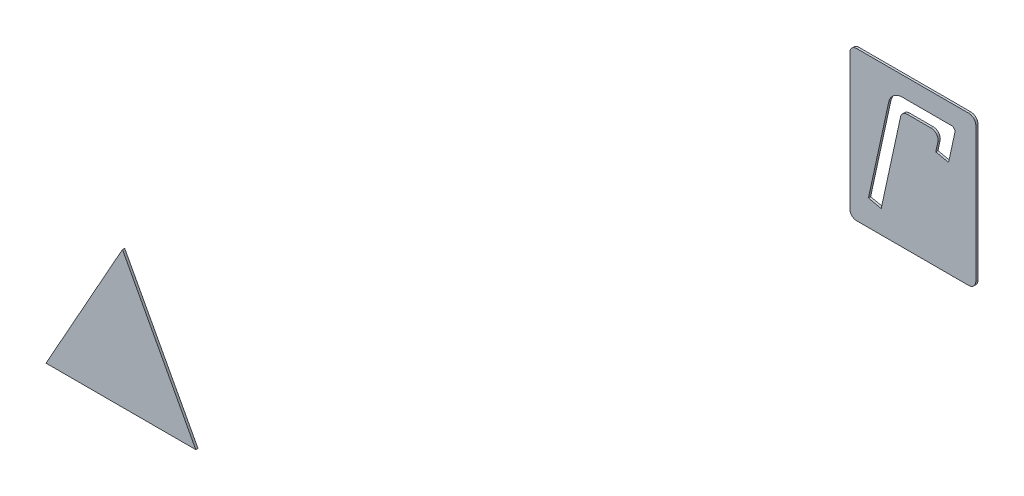
ISO-10303-21;
HEADER;
FILE_DESCRIPTION(('STEP AP214'),'2;1');
FILE_NAME('part.step','',(''),(''),'','','');
FILE_SCHEMA(('AUTOMOTIVE_DESIGN { 1 0 10303 214 1 1 1 1 }'));
ENDSEC;
DATA;
#1=APPLICATION_CONTEXT('core data for automotive mechanical design processes');
#2=APPLICATION_PROTOCOL_DEFINITION('international standard','automotive_design',2000,#1);
#3=PRODUCT_CONTEXT('',#1,'mechanical');
#4=PRODUCT('Part','Part','',(#3));
#5=PRODUCT_RELATED_PRODUCT_CATEGORY('part','',(#4));
#6=PRODUCT_DEFINITION_FORMATION('','',#4);
#7=PRODUCT_DEFINITION_CONTEXT('part definition',#1,'design');
#8=PRODUCT_DEFINITION('design','',#6,#7);
#9=PRODUCT_DEFINITION_SHAPE('','',#8);
#10=(LENGTH_UNIT() NAMED_UNIT(*) SI_UNIT(.MILLI.,.METRE.));
#11=(NAMED_UNIT(*) PLANE_ANGLE_UNIT() SI_UNIT($,.RADIAN.));
#12=(NAMED_UNIT(*) SI_UNIT($,.STERADIAN.) SOLID_ANGLE_UNIT());
#13=UNCERTAINTY_MEASURE_WITH_UNIT(LENGTH_MEASURE(1.E-05),#10,'distance_accuracy_value','');
#14=(GEOMETRIC_REPRESENTATION_CONTEXT(3) GLOBAL_UNCERTAINTY_ASSIGNED_CONTEXT((#13)) GLOBAL_UNIT_ASSIGNED_CONTEXT((#10,
#11,#12)) REPRESENTATION_CONTEXT('',''));
#15=CARTESIAN_POINT('',(0.,0.,0.));
#16=DIRECTION('',(0.,0.,1.));
#17=DIRECTION('',(1.,0.,0.));
#18=AXIS2_PLACEMENT_3D('',#15,#16,#17);
#19=CARTESIAN_POINT('',(9.86501290286,-17.72608045677,4.341));
#20=DIRECTION('',(0.,0.,1.));
#21=DIRECTION('',(1.,0.,0.));
#22=AXIS2_PLACEMENT_3D('',#19,#20,#21);
#23=PLANE('',#22);
#24=DIRECTION('',(1.,0.,0.));
#25=VECTOR('',#24,1.);
#26=CARTESIAN_POINT('',(9.761467361042,-17.97264852336,4.341));
#27=LINE('',#26,#25);
#28=CARTESIAN_POINT('',(9.41625321547516,-17.9726485233601,4.341));
#29=VERTEX_POINT('',#28);
#30=CARTESIAN_POINT('',(10.09247398621,-17.97264852336,4.341));
#31=VERTEX_POINT('',#30);
#32=EDGE_CURVE('P0_E20',#29,#31,#27,.T.);
#33=ORIENTED_EDGE('',*,*,#32,.F.);
#34=DIRECTION('',(-0.488242865136101,-0.872707800265181,0.));
#35=VECTOR('',#34,1.);
#36=CARTESIAN_POINT('',(9.761467361042,-17.35559684865,4.341));
#37=LINE('',#36,#35);
#38=CARTESIAN_POINT('',(9.76146736104225,-17.3555968486499,4.341));
#39=VERTEX_POINT('',#38);
#40=EDGE_CURVE('P0_E52',#39,#29,#37,.T.);
#41=ORIENTED_EDGE('',*,*,#40,.F.);
#42=DIRECTION('',(-0.472713166838797,0.881216353625621,0.));
#43=VECTOR('',#42,1.);
#44=CARTESIAN_POINT('',(10.09247398621,-17.97264852336,4.341));
#45=LINE('',#44,#43);
#46=EDGE_CURVE('P0_E53',#31,#39,#45,.T.);
#47=ORIENTED_EDGE('',*,*,#46,.F.);
#48=EDGE_LOOP('',(#33,#41,#47));
#49=FACE_BOUND('',#48,.T.);
#50=ADVANCED_FACE('P0_F17',(#49),#23,.F.);
#51=CARTESIAN_POINT('',(9.761467361042,-17.97264852336,4.341));
#52=DIRECTION('',(0.,-1.,0.));
#53=DIRECTION('',(1.,0.,0.));
#54=AXIS2_PLACEMENT_3D('',#51,#52,#53);
#55=PLANE('',#54);
#56=DIRECTION('',(1.,0.,0.));
#57=VECTOR('',#56,1.);
#58=CARTESIAN_POINT('',(9.86501290286,-17.97264852336,4.351));
#59=LINE('',#58,#57);
#60=CARTESIAN_POINT('',(9.41625321547516,-17.9726485233601,4.351));
#61=VERTEX_POINT('',#60);
#62=CARTESIAN_POINT('',(10.09247398621,-17.97264852336,4.351));
#63=VERTEX_POINT('',#62);
#64=EDGE_CURVE('P0_E60',#61,#63,#59,.T.);
#65=ORIENTED_EDGE('',*,*,#64,.F.);
#66=DIRECTION('',(0.,0.,1.));
#67=VECTOR('',#66,1.);
#68=CARTESIAN_POINT('',(9.41625321547566,-17.9726485233604,4.341));
#69=LINE('',#68,#67);
#70=EDGE_CURVE('P0_E57',#29,#61,#69,.T.);
#71=ORIENTED_EDGE('',*,*,#70,.F.);
#72=ORIENTED_EDGE('',*,*,#32,.T.);
#73=DIRECTION('',(0.,0.,1.));
#74=VECTOR('',#73,1.);
#75=CARTESIAN_POINT('',(10.09247398621,-17.97264852336,4.341));
#76=LINE('',#75,#74);
#77=EDGE_CURVE('P0_E64',#63,#31,#76,.F.);
#78=ORIENTED_EDGE('',*,*,#77,.F.);
#79=EDGE_LOOP('',(#65,#71,#72,#78));
#80=FACE_BOUND('',#79,.T.);
#81=ADVANCED_FACE('P0_F58',(#80),#55,.T.);
#82=CARTESIAN_POINT('',(10.09247398621,-17.97264852336,4.341));
#83=DIRECTION('',(0.881216353625621,0.472713166838797,0.));
#84=DIRECTION('',(-0.472713166838797,0.881216353625621,0.));
#85=AXIS2_PLACEMENT_3D('',#82,#83,#84);
#86=PLANE('',#85);
#87=DIRECTION('',(-0.472713166840206,0.881216353624866,0.));
#88=VECTOR('',#87,1.);
#89=CARTESIAN_POINT('',(10.09247398621,-17.97264852336,4.351));
#90=LINE('',#89,#88);
#91=CARTESIAN_POINT('',(9.76146736104249,-17.3555968486497,4.351));
#92=VERTEX_POINT('',#91);
#93=EDGE_CURVE('P0_E26',#63,#92,#90,.T.);
#94=ORIENTED_EDGE('',*,*,#93,.F.);
#95=ORIENTED_EDGE('',*,*,#77,.T.);
#96=ORIENTED_EDGE('',*,*,#46,.T.);
#97=DIRECTION('',(0.,0.,1.));
#98=VECTOR('',#97,1.);
#99=CARTESIAN_POINT('',(9.761467361042,-17.35559684865,4.341));
#100=LINE('',#99,#98);
#101=EDGE_CURVE('P0_E35',#92,#39,#100,.F.);
#102=ORIENTED_EDGE('',*,*,#101,.F.);
#103=EDGE_LOOP('',(#94,#95,#96,#102));
#104=FACE_BOUND('',#103,.T.);
#105=ADVANCED_FACE('P0_F68',(#104),#86,.T.);
#106=CARTESIAN_POINT('',(9.761467361042,-17.35559684865,4.341));
#107=DIRECTION('',(-0.872707800265181,0.488242865136101,0.));
#108=DIRECTION('',(-0.488242865136101,-0.872707800265181,0.));
#109=AXIS2_PLACEMENT_3D('',#106,#107,#108);
#110=PLANE('',#109);
#111=DIRECTION('',(-0.488242865137037,-0.872707800264657,0.));
#112=VECTOR('',#111,1.);
#113=CARTESIAN_POINT('',(9.761467361042,-17.35559684865,4.351));
#114=LINE('',#113,#112);
#115=EDGE_CURVE('P0_E11',#92,#61,#114,.T.);
#116=ORIENTED_EDGE('',*,*,#115,.F.);
#117=ORIENTED_EDGE('',*,*,#101,.T.);
#118=ORIENTED_EDGE('',*,*,#40,.T.);
#119=ORIENTED_EDGE('',*,*,#70,.T.);
#120=EDGE_LOOP('',(#116,#117,#118,#119));
#121=FACE_BOUND('',#120,.T.);
#122=ADVANCED_FACE('P0_F63',(#121),#110,.T.);
#123=CARTESIAN_POINT('',(9.86501290286,-17.72608045677,4.351));
#124=DIRECTION('',(0.,0.,1.));
#125=DIRECTION('',(1.,0.,0.));
#126=AXIS2_PLACEMENT_3D('',#123,#124,#125);
#127=PLANE('',#126);
#128=ORIENTED_EDGE('',*,*,#93,.T.);
#129=ORIENTED_EDGE('',*,*,#115,.T.);
#130=ORIENTED_EDGE('',*,*,#64,.T.);
#131=EDGE_LOOP('',(#128,#129,#130));
#132=FACE_BOUND('',#131,.T.);
#133=ADVANCED_FACE('P0_F72',(#132),#127,.T.);
#134=CLOSED_SHELL('',(#50,#81,#105,#122,#133));
#135=MANIFOLD_SOLID_BREP('P0_B1',#134);
#136=CARTESIAN_POINT('',(13.329788025237,-15.24896694961,4.341));
#137=DIRECTION('',(0.,0.,1.));
#138=DIRECTION('',(1.,0.,0.));
#139=AXIS2_PLACEMENT_3D('',#136,#137,#138);
#140=PLANE('',#139);
#141=DIRECTION('',(0.212429649393078,0.977176362822359,0.));
#142=VECTOR('',#141,1.);
#143=CARTESIAN_POINT('',(13.491343037065,-15.15019530967,4.341));
#144=LINE('',#143,#142);
#145=CARTESIAN_POINT('',(13.4913430370655,-15.1501953096677,4.341));
#146=VERTEX_POINT('',#145);
#147=CARTESIAN_POINT('',(13.5213893741724,-15.0119821624201,4.341));
#148=VERTEX_POINT('',#147);
#149=EDGE_CURVE('P1_E220',#146,#148,#144,.T.);
#150=ORIENTED_EDGE('',*,*,#149,.T.);
#151=DIRECTION('',(-0.598473967642059,0.801142253320078,0.));
#152=VECTOR('',#151,1.);
#153=CARTESIAN_POINT('',(13.521389374172,-15.01198216242,4.341));
#154=LINE('',#153,#152);
#155=CARTESIAN_POINT('',(13.5120221155434,-14.9994427587192,4.341));
#156=VERTEX_POINT('',#155);
#157=EDGE_CURVE('P1_E264',#148,#156,#154,.T.);
#158=ORIENTED_EDGE('',*,*,#157,.T.);
#159=DIRECTION('',(-1.,0.,0.));
#160=VECTOR('',#159,1.);
#161=CARTESIAN_POINT('',(13.512022115542,-14.99944275872,4.341));
#162=LINE('',#161,#160);
#163=CARTESIAN_POINT('',(13.283041815261,-14.99944275872,4.341));
#164=VERTEX_POINT('',#163);
#165=EDGE_CURVE('P1_E258',#156,#164,#162,.T.);
#166=ORIENTED_EDGE('',*,*,#165,.T.);
#167=CARTESIAN_POINT('',(13.283041815261,-15.06294275872,4.341));
#168=DIRECTION('',(0.,0.,1.));
#169=DIRECTION('',(1.,0.,0.));
#170=AXIS2_PLACEMENT_3D('',#167,#168,#169);
#171=CIRCLE('',#170,0.0635);
#172=CARTESIAN_POINT('',(13.2209911162214,-15.0494534759818,4.341));
#173=VERTEX_POINT('',#172);
#174=EDGE_CURVE('P1_E221',#164,#173,#171,.T.);
#175=ORIENTED_EDGE('',*,*,#174,.T.);
#176=DIRECTION('',(-0.212429649393078,-0.977176362822359,0.));
#177=VECTOR('',#176,1.);
#178=CARTESIAN_POINT('',(13.220991116221,-15.04945347598,4.341));
#179=LINE('',#178,#177);
#180=CARTESIAN_POINT('',(13.1295784055075,-15.4699519347699,4.341));
#181=VERTEX_POINT('',#180);
#182=EDGE_CURVE('P1_E269',#173,#181,#179,.T.);
#183=ORIENTED_EDGE('',*,*,#182,.T.);
#184=DIRECTION('',(0.977176362822359,-0.212429649393078,0.));
#185=VECTOR('',#184,1.);
#186=CARTESIAN_POINT('',(13.129578405508,-15.46995193477,4.341));
#187=LINE('',#186,#185);
#188=CARTESIAN_POINT('',(13.1872596611016,-15.4824913384719,4.341));
#189=VERTEX_POINT('',#188);
#190=EDGE_CURVE('P1_E275',#181,#189,#187,.T.);
#191=ORIENTED_EDGE('',*,*,#190,.T.);
#192=DIRECTION('',(0.212429649393078,0.977176362822359,0.));
#193=VECTOR('',#192,1.);
#194=CARTESIAN_POINT('',(13.187259661102,-15.48249133847,4.341));
#195=LINE('',#194,#193);
#196=CARTESIAN_POINT('',(13.2747410608501,-15.080076909671,4.341));
#197=VERTEX_POINT('',#196);
#198=EDGE_CURVE('P1_E281',#189,#197,#195,.T.);
#199=ORIENTED_EDGE('',*,*,#198,.T.);
#200=CARTESIAN_POINT('',(13.305766410369,-15.08682155104,4.341));
#201=DIRECTION('',(0.,0.,1.));
#202=DIRECTION('',(1.,0.,0.));
#203=AXIS2_PLACEMENT_3D('',#200,#201,#202);
#204=CIRCLE('',#203,0.03175);
#205=CARTESIAN_POINT('',(13.305766410369,-15.05507155104,4.341));
#206=VERTEX_POINT('',#205);
#207=EDGE_CURVE('P1_E226',#206,#197,#204,.T.);
#208=ORIENTED_EDGE('',*,*,#207,.F.);
#209=DIRECTION('',(1.,0.,0.));
#210=VECTOR('',#209,1.);
#211=CARTESIAN_POINT('',(13.305766410369,-15.05507155104,4.341));
#212=LINE('',#211,#210);
#213=CARTESIAN_POINT('',(13.412221152528,-15.05507155104,4.341));
#214=VERTEX_POINT('',#213);
#215=EDGE_CURVE('P1_E229',#206,#214,#212,.T.);
#216=ORIENTED_EDGE('',*,*,#215,.T.);
#217=CARTESIAN_POINT('',(13.412221152528,-15.08682155104,4.341));
#218=DIRECTION('',(0.,0.,1.));
#219=DIRECTION('',(1.,0.,0.));
#220=AXIS2_PLACEMENT_3D('',#217,#218,#219);
#221=CIRCLE('',#220,0.03175);
#222=CARTESIAN_POINT('',(13.4432465020478,-15.0935661924091,4.341));
#223=VERTEX_POINT('',#222);
#224=EDGE_CURVE('P1_E230',#223,#214,#221,.T.);
#225=ORIENTED_EDGE('',*,*,#224,.F.);
#226=DIRECTION('',(-0.212429649393078,-0.977176362822359,0.));
#227=VECTOR('',#226,1.);
#228=CARTESIAN_POINT('',(13.443246502048,-15.09356619241,4.341));
#229=LINE('',#228,#227);
#230=CARTESIAN_POINT('',(13.4336617814715,-15.1376559059601,4.341));
#231=VERTEX_POINT('',#230);
#232=EDGE_CURVE('P1_E233',#223,#231,#229,.T.);
#233=ORIENTED_EDGE('',*,*,#232,.T.);
#234=DIRECTION('',(0.977176362822359,-0.212429649393078,0.));
#235=VECTOR('',#234,1.);
#236=CARTESIAN_POINT('',(13.433661781471,-15.13765590596,4.341));
#237=LINE('',#236,#235);
#238=EDGE_CURVE('P1_E248',#231,#146,#237,.T.);
#239=ORIENTED_EDGE('',*,*,#238,.T.);
#240=EDGE_LOOP('',(#150,#158,#166,#175,#183,#191,#199,#208,#216,#225,#233,#239));
#241=FACE_BOUND('',#240,.T.);
#242=DIRECTION('',(1.,0.,0.));
#243=VECTOR('',#242,1.);
#244=CARTESIAN_POINT('',(13.077011425788,-15.58575353028,4.341));
#245=LINE('',#244,#243);
#246=CARTESIAN_POINT('',(13.077011425788,-15.58575353028,4.341));
#247=VERTEX_POINT('',#246);
#248=CARTESIAN_POINT('',(13.582564624686,-15.58575353028,4.341));
#249=VERTEX_POINT('',#248);
#250=EDGE_CURVE('P1_E153',#247,#249,#245,.T.);
#251=ORIENTED_EDGE('',*,*,#250,.F.);
#252=CARTESIAN_POINT('',(13.077011425788,-15.55400353028,4.341));
#253=DIRECTION('',(0.,0.,1.));
#254=DIRECTION('',(1.,0.,0.));
#255=AXIS2_PLACEMENT_3D('',#252,#253,#254);
#256=CIRCLE('',#255,0.03175);
#257=CARTESIAN_POINT('',(13.045261425788,-15.55400353028,4.341));
#258=VERTEX_POINT('',#257);
#259=EDGE_CURVE('P1_E174',#258,#247,#256,.T.);
#260=ORIENTED_EDGE('',*,*,#259,.F.);
#261=DIRECTION('',(0.,1.,0.));
#262=VECTOR('',#261,1.);
#263=CARTESIAN_POINT('',(13.045261425788,-14.94393036894,4.341));
#264=LINE('',#263,#262);
#265=CARTESIAN_POINT('',(13.045261425788,-14.94393036894,4.341));
#266=VERTEX_POINT('',#265);
#267=EDGE_CURVE('P1_E180',#266,#258,#264,.F.);
#268=ORIENTED_EDGE('',*,*,#267,.F.);
#269=CARTESIAN_POINT('',(13.077011425788,-14.94393036894,4.341));
#270=DIRECTION('',(0.,0.,1.));
#271=DIRECTION('',(1.,0.,0.));
#272=AXIS2_PLACEMENT_3D('',#269,#270,#271);
#273=CIRCLE('',#272,0.03175);
#274=CARTESIAN_POINT('',(13.077011425788,-14.91218036894,4.341));
#275=VERTEX_POINT('',#274);
#276=EDGE_CURVE('P1_E235',#275,#266,#273,.T.);
#277=ORIENTED_EDGE('',*,*,#276,.F.);
#278=DIRECTION('',(-1.,0.,0.));
#279=VECTOR('',#278,1.);
#280=CARTESIAN_POINT('',(13.582564624686,-14.91218036894,4.341));
#281=LINE('',#280,#279);
#282=CARTESIAN_POINT('',(13.582564624686,-14.91218036894,4.341));
#283=VERTEX_POINT('',#282);
#284=EDGE_CURVE('P1_E185',#283,#275,#281,.T.);
#285=ORIENTED_EDGE('',*,*,#284,.F.);
#286=CARTESIAN_POINT('',(13.582564624686,-14.94393036894,4.341));
#287=DIRECTION('',(0.,0.,1.));
#288=DIRECTION('',(1.,0.,0.));
#289=AXIS2_PLACEMENT_3D('',#286,#287,#288);
#290=CIRCLE('',#289,0.03175);
#291=CARTESIAN_POINT('',(13.614314624686,-14.94393036894,4.341));
#292=VERTEX_POINT('',#291);
#293=EDGE_CURVE('P1_E237',#292,#283,#290,.T.);
#294=ORIENTED_EDGE('',*,*,#293,.F.);
#295=DIRECTION('',(0.,1.,0.));
#296=VECTOR('',#295,1.);
#297=CARTESIAN_POINT('',(13.614314624686,-15.55400353028,4.341));
#298=LINE('',#297,#296);
#299=CARTESIAN_POINT('',(13.614314624686,-15.55400353028,4.341));
#300=VERTEX_POINT('',#299);
#301=EDGE_CURVE('P1_E156',#300,#292,#298,.T.);
#302=ORIENTED_EDGE('',*,*,#301,.F.);
#303=CARTESIAN_POINT('',(13.582564624686,-15.55400353028,4.341));
#304=DIRECTION('',(0.,0.,1.));
#305=DIRECTION('',(1.,0.,0.));
#306=AXIS2_PLACEMENT_3D('',#303,#304,#305);
#307=CIRCLE('',#306,0.03175);
#308=EDGE_CURVE('P1_E20',#249,#300,#307,.T.);
#309=ORIENTED_EDGE('',*,*,#308,.F.);
#310=EDGE_LOOP('',(#251,#260,#268,#277,#285,#294,#302,#309));
#311=FACE_BOUND('',#310,.T.);
#312=ADVANCED_FACE('P1_F17',(#241,#311),#140,.F.);
#313=CARTESIAN_POINT('',(13.582564624686,-15.55400353028,4.341));
#314=DIRECTION('',(0.,0.,1.));
#315=DIRECTION('',(1.,0.,0.));
#316=AXIS2_PLACEMENT_3D('',#313,#314,#315);
#317=CYLINDRICAL_SURFACE('',#316,0.03175);
#318=CARTESIAN_POINT('',(13.582564624686,-15.55400353028,4.351));
#319=DIRECTION('',(0.,0.,1.));
#320=DIRECTION('',(1.,0.,0.));
#321=AXIS2_PLACEMENT_3D('',#318,#319,#320);
#322=CIRCLE('',#321,0.03175);
#323=CARTESIAN_POINT('',(13.582564624686,-15.58575353028,4.351));
#324=VERTEX_POINT('',#323);
#325=CARTESIAN_POINT('',(13.614314624686,-15.55400353028,4.351));
#326=VERTEX_POINT('',#325);
#327=EDGE_CURVE('P1_E163',#324,#326,#322,.T.);
#328=ORIENTED_EDGE('',*,*,#327,.F.);
#329=DIRECTION('',(0.,0.,1.));
#330=VECTOR('',#329,1.);
#331=CARTESIAN_POINT('',(13.582564624686,-15.58575353028,4.341));
#332=LINE('',#331,#330);
#333=EDGE_CURVE('P1_E160',#249,#324,#332,.T.);
#334=ORIENTED_EDGE('',*,*,#333,.F.);
#335=ORIENTED_EDGE('',*,*,#308,.T.);
#336=DIRECTION('',(0.,0.,-1.));
#337=VECTOR('',#336,1.);
#338=CARTESIAN_POINT('',(13.614314624686,-15.55400353028,4.341));
#339=LINE('',#338,#337);
#340=EDGE_CURVE('P1_E191',#326,#300,#339,.T.);
#341=ORIENTED_EDGE('',*,*,#340,.F.);
#342=EDGE_LOOP('',(#328,#334,#335,#341));
#343=FACE_BOUND('',#342,.T.);
#344=ADVANCED_FACE('P1_F161',(#343),#317,.T.);
#345=CARTESIAN_POINT('',(13.614314624686,-15.55400353028,4.341));
#346=DIRECTION('',(1.,0.,0.));
#347=DIRECTION('',(0.,0.,-1.));
#348=AXIS2_PLACEMENT_3D('',#345,#346,#347);
#349=PLANE('',#348);
#350=DIRECTION('',(0.,1.,0.));
#351=VECTOR('',#350,1.);
#352=CARTESIAN_POINT('',(13.614314624686,-15.24896694961,4.351));
#353=LINE('',#352,#351);
#354=CARTESIAN_POINT('',(13.614314624686,-14.94393036894,4.351));
#355=VERTEX_POINT('',#354);
#356=EDGE_CURVE('P1_E218',#326,#355,#353,.T.);
#357=ORIENTED_EDGE('',*,*,#356,.F.);
#358=ORIENTED_EDGE('',*,*,#340,.T.);
#359=ORIENTED_EDGE('',*,*,#301,.T.);
#360=DIRECTION('',(0.,0.,1.));
#361=VECTOR('',#360,1.);
#362=CARTESIAN_POINT('',(13.614314624686,-14.94393036894,4.341));
#363=LINE('',#362,#361);
#364=EDGE_CURVE('P1_E189',#355,#292,#363,.F.);
#365=ORIENTED_EDGE('',*,*,#364,.F.);
#366=EDGE_LOOP('',(#357,#358,#359,#365));
#367=FACE_BOUND('',#366,.T.);
#368=ADVANCED_FACE('P1_F574',(#367),#349,.T.);
#369=CARTESIAN_POINT('',(13.582564624686,-14.94393036894,4.341));
#370=DIRECTION('',(0.,0.,1.));
#371=DIRECTION('',(1.,0.,0.));
#372=AXIS2_PLACEMENT_3D('',#369,#370,#371);
#373=CYLINDRICAL_SURFACE('',#372,0.03175);
#374=CARTESIAN_POINT('',(13.582564624686,-14.94393036894,4.351));
#375=DIRECTION('',(0.,0.,1.));
#376=DIRECTION('',(1.,0.,0.));
#377=AXIS2_PLACEMENT_3D('',#374,#375,#376);
#378=CIRCLE('',#377,0.03175);
#379=CARTESIAN_POINT('',(13.582564624686,-14.91218036894,4.351));
#380=VERTEX_POINT('',#379);
#381=EDGE_CURVE('P1_E215',#355,#380,#378,.T.);
#382=ORIENTED_EDGE('',*,*,#381,.F.);
#383=ORIENTED_EDGE('',*,*,#364,.T.);
#384=ORIENTED_EDGE('',*,*,#293,.T.);
#385=DIRECTION('',(0.,0.,1.));
#386=VECTOR('',#385,1.);
#387=CARTESIAN_POINT('',(13.582564624686,-14.91218036894,4.341));
#388=LINE('',#387,#386);
#389=EDGE_CURVE('P1_E188',#380,#283,#388,.F.);
#390=ORIENTED_EDGE('',*,*,#389,.F.);
#391=EDGE_LOOP('',(#382,#383,#384,#390));
#392=FACE_BOUND('',#391,.T.);
#393=ADVANCED_FACE('P1_F321',(#392),#373,.T.);
#394=CARTESIAN_POINT('',(13.582564624686,-14.91218036894,4.341));
#395=DIRECTION('',(0.,1.,0.));
#396=DIRECTION('',(-1.,0.,0.));
#397=AXIS2_PLACEMENT_3D('',#394,#395,#396);
#398=PLANE('',#397);
#399=DIRECTION('',(1.,0.,0.));
#400=VECTOR('',#399,1.);
#401=CARTESIAN_POINT('',(13.329788025237,-14.91218036894,4.351));
#402=LINE('',#401,#400);
#403=CARTESIAN_POINT('',(13.077011425788,-14.91218036894,4.351));
#404=VERTEX_POINT('',#403);
#405=EDGE_CURVE('P1_E214',#380,#404,#402,.F.);
#406=ORIENTED_EDGE('',*,*,#405,.F.);
#407=ORIENTED_EDGE('',*,*,#389,.T.);
#408=ORIENTED_EDGE('',*,*,#284,.T.);
#409=DIRECTION('',(0.,0.,1.));
#410=VECTOR('',#409,1.);
#411=CARTESIAN_POINT('',(13.077011425788,-14.91218036894,4.341));
#412=LINE('',#411,#410);
#413=EDGE_CURVE('P1_E184',#404,#275,#412,.F.);
#414=ORIENTED_EDGE('',*,*,#413,.F.);
#415=EDGE_LOOP('',(#406,#407,#408,#414));
#416=FACE_BOUND('',#415,.T.);
#417=ADVANCED_FACE('P1_F318',(#416),#398,.T.);
#418=CARTESIAN_POINT('',(13.077011425788,-14.94393036894,4.341));
#419=DIRECTION('',(0.,0.,1.));
#420=DIRECTION('',(1.,0.,0.));
#421=AXIS2_PLACEMENT_3D('',#418,#419,#420);
#422=CYLINDRICAL_SURFACE('',#421,0.03175);
#423=CARTESIAN_POINT('',(13.077011425788,-14.94393036894,4.351));
#424=DIRECTION('',(0.,0.,1.));
#425=DIRECTION('',(1.,0.,0.));
#426=AXIS2_PLACEMENT_3D('',#423,#424,#425);
#427=CIRCLE('',#426,0.03175);
#428=CARTESIAN_POINT('',(13.045261425788,-14.94393036894,4.351));
#429=VERTEX_POINT('',#428);
#430=EDGE_CURVE('P1_E211',#404,#429,#427,.T.);
#431=ORIENTED_EDGE('',*,*,#430,.F.);
#432=ORIENTED_EDGE('',*,*,#413,.T.);
#433=ORIENTED_EDGE('',*,*,#276,.T.);
#434=DIRECTION('',(0.,0.,1.));
#435=VECTOR('',#434,1.);
#436=CARTESIAN_POINT('',(13.045261425788,-14.94393036894,4.341));
#437=LINE('',#436,#435);
#438=EDGE_CURVE('P1_E183',#429,#266,#437,.F.);
#439=ORIENTED_EDGE('',*,*,#438,.F.);
#440=EDGE_LOOP('',(#431,#432,#433,#439));
#441=FACE_BOUND('',#440,.T.);
#442=ADVANCED_FACE('P1_F416',(#441),#422,.T.);
#443=CARTESIAN_POINT('',(13.045261425788,-14.94393036894,4.341));
#444=DIRECTION('',(-1.,0.,0.));
#445=DIRECTION('',(0.,0.,1.));
#446=AXIS2_PLACEMENT_3D('',#443,#444,#445);
#447=PLANE('',#446);
#448=DIRECTION('',(0.,1.,0.));
#449=VECTOR('',#448,1.);
#450=CARTESIAN_POINT('',(13.045261425788,-15.24896694961,4.351));
#451=LINE('',#450,#449);
#452=CARTESIAN_POINT('',(13.045261425788,-15.55400353028,4.351));
#453=VERTEX_POINT('',#452);
#454=EDGE_CURVE('P1_E210',#429,#453,#451,.F.);
#455=ORIENTED_EDGE('',*,*,#454,.F.);
#456=ORIENTED_EDGE('',*,*,#438,.T.);
#457=ORIENTED_EDGE('',*,*,#267,.T.);
#458=DIRECTION('',(0.,0.,1.));
#459=VECTOR('',#458,1.);
#460=CARTESIAN_POINT('',(13.045261425788,-15.55400353028,4.341));
#461=LINE('',#460,#459);
#462=EDGE_CURVE('P1_E171',#453,#258,#461,.F.);
#463=ORIENTED_EDGE('',*,*,#462,.F.);
#464=EDGE_LOOP('',(#455,#456,#457,#463));
#465=FACE_BOUND('',#464,.T.);
#466=ADVANCED_FACE('P1_F412',(#465),#447,.T.);
#467=CARTESIAN_POINT('',(13.077011425788,-15.55400353028,4.341));
#468=DIRECTION('',(0.,0.,1.));
#469=DIRECTION('',(1.,0.,0.));
#470=AXIS2_PLACEMENT_3D('',#467,#468,#469);
#471=CYLINDRICAL_SURFACE('',#470,0.03175);
#472=CARTESIAN_POINT('',(13.077011425788,-15.55400353028,4.351));
#473=DIRECTION('',(0.,0.,1.));
#474=DIRECTION('',(1.,0.,0.));
#475=AXIS2_PLACEMENT_3D('',#472,#473,#474);
#476=CIRCLE('',#475,0.03175);
#477=CARTESIAN_POINT('',(13.077011425788,-15.58575353028,4.351));
#478=VERTEX_POINT('',#477);
#479=EDGE_CURVE('P1_E206',#453,#478,#476,.T.);
#480=ORIENTED_EDGE('',*,*,#479,.F.);
#481=ORIENTED_EDGE('',*,*,#462,.T.);
#482=ORIENTED_EDGE('',*,*,#259,.T.);
#483=DIRECTION('',(0.,0.,1.));
#484=VECTOR('',#483,1.);
#485=CARTESIAN_POINT('',(13.077011425788,-15.58575353028,4.341));
#486=LINE('',#485,#484);
#487=EDGE_CURVE('P1_E167',#478,#247,#486,.F.);
#488=ORIENTED_EDGE('',*,*,#487,.F.);
#489=EDGE_LOOP('',(#480,#481,#482,#488));
#490=FACE_BOUND('',#489,.T.);
#491=ADVANCED_FACE('P1_F414',(#490),#471,.T.);
#492=CARTESIAN_POINT('',(13.077011425788,-15.58575353028,4.341));
#493=DIRECTION('',(0.,-1.,0.));
#494=DIRECTION('',(1.,0.,0.));
#495=AXIS2_PLACEMENT_3D('',#492,#493,#494);
#496=PLANE('',#495);
#497=DIRECTION('',(1.,0.,0.));
#498=VECTOR('',#497,1.);
#499=CARTESIAN_POINT('',(13.329788025237,-15.58575353028,4.351));
#500=LINE('',#499,#498);
#501=EDGE_CURVE('P1_E209',#478,#324,#500,.T.);
#502=ORIENTED_EDGE('',*,*,#501,.F.);
#503=ORIENTED_EDGE('',*,*,#487,.T.);
#504=ORIENTED_EDGE('',*,*,#250,.T.);
#505=ORIENTED_EDGE('',*,*,#333,.T.);
#506=EDGE_LOOP('',(#502,#503,#504,#505));
#507=FACE_BOUND('',#506,.T.);
#508=ADVANCED_FACE('P1_F170',(#507),#496,.T.);
#509=CARTESIAN_POINT('',(13.433661781471,-15.13765590596,4.341));
#510=DIRECTION('',(-0.212429649393078,-0.977176362822359,0.));
#511=DIRECTION('',(0.977176362822359,-0.212429649393078,0.));
#512=AXIS2_PLACEMENT_3D('',#509,#510,#511);
#513=PLANE('',#512);
#514=DIRECTION('',(0.,0.,1.));
#515=VECTOR('',#514,1.);
#516=CARTESIAN_POINT('',(13.4336617814718,-15.1376559059602,4.341));
#517=LINE('',#516,#515);
#518=CARTESIAN_POINT('',(13.4336617814713,-15.1376559059601,4.351));
#519=VERTEX_POINT('',#518);
#520=EDGE_CURVE('P1_E250',#231,#519,#517,.T.);
#521=ORIENTED_EDGE('',*,*,#520,.T.);
#522=DIRECTION('',(-0.977176362797487,0.212429649507488,0.));
#523=VECTOR('',#522,1.);
#524=CARTESIAN_POINT('',(13.491343037065,-15.15019530967,4.351));
#525=LINE('',#524,#523);
#526=CARTESIAN_POINT('',(13.491343037065,-15.15019530967,4.351));
#527=VERTEX_POINT('',#526);
#528=EDGE_CURVE('P1_E301',#527,#519,#525,.T.);
#529=ORIENTED_EDGE('',*,*,#528,.F.);
#530=DIRECTION('',(0.,0.,1.));
#531=VECTOR('',#530,1.);
#532=CARTESIAN_POINT('',(13.491343037065,-15.15019530967,4.341));
#533=LINE('',#532,#531);
#534=EDGE_CURVE('P1_E255',#527,#146,#533,.F.);
#535=ORIENTED_EDGE('',*,*,#534,.T.);
#536=ORIENTED_EDGE('',*,*,#238,.F.);
#537=EDGE_LOOP('',(#521,#529,#535,#536));
#538=FACE_BOUND('',#537,.T.);
#539=ADVANCED_FACE('P1_F364',(#538),#513,.F.);
#540=CARTESIAN_POINT('',(13.443246502048,-15.09356619241,4.341));
#541=DIRECTION('',(-0.977176362822359,0.212429649393078,0.));
#542=DIRECTION('',(-0.212429649393078,-0.977176362822359,0.));
#543=AXIS2_PLACEMENT_3D('',#540,#541,#542);
#544=PLANE('',#543);
#545=DIRECTION('',(0.,0.,1.));
#546=VECTOR('',#545,1.);
#547=CARTESIAN_POINT('',(13.4432465020473,-15.0935661924098,4.341));
#548=LINE('',#547,#546);
#549=CARTESIAN_POINT('',(13.4432465020477,-15.0935661924094,4.351));
#550=VERTEX_POINT('',#549);
#551=EDGE_CURVE('P1_E232',#550,#223,#548,.F.);
#552=ORIENTED_EDGE('',*,*,#551,.F.);
#553=DIRECTION('',(0.212429649411111,0.977176362818438,0.));
#554=VECTOR('',#553,1.);
#555=CARTESIAN_POINT('',(13.433661781471,-15.13765590596,4.351));
#556=LINE('',#555,#554);
#557=EDGE_CURVE('P1_E205',#519,#550,#556,.T.);
#558=ORIENTED_EDGE('',*,*,#557,.F.);
#559=ORIENTED_EDGE('',*,*,#520,.F.);
#560=ORIENTED_EDGE('',*,*,#232,.F.);
#561=EDGE_LOOP('',(#552,#558,#559,#560));
#562=FACE_BOUND('',#561,.T.);
#563=ADVANCED_FACE('P1_F360',(#562),#544,.F.);
#564=CARTESIAN_POINT('',(13.412221152528,-15.08682155104,4.341));
#565=DIRECTION('',(0.,0.,1.));
#566=DIRECTION('',(1.,0.,0.));
#567=AXIS2_PLACEMENT_3D('',#564,#565,#566);
#568=CYLINDRICAL_SURFACE('',#567,0.03175);
#569=CARTESIAN_POINT('',(13.412221152528,-15.08682155104,4.351));
#570=DIRECTION('',(0.,0.,1.));
#571=DIRECTION('',(1.,0.,0.));
#572=AXIS2_PLACEMENT_3D('',#569,#570,#571);
#573=CIRCLE('',#572,0.03175);
#574=CARTESIAN_POINT('',(13.412221152528,-15.05507155104,4.351));
#575=VERTEX_POINT('',#574);
#576=EDGE_CURVE('P1_E202',#550,#575,#573,.T.);
#577=ORIENTED_EDGE('',*,*,#576,.F.);
#578=ORIENTED_EDGE('',*,*,#551,.T.);
#579=ORIENTED_EDGE('',*,*,#224,.T.);
#580=DIRECTION('',(0.,0.,1.));
#581=VECTOR('',#580,1.);
#582=CARTESIAN_POINT('',(13.412221152528,-15.05507155104,4.341));
#583=LINE('',#582,#581);
#584=EDGE_CURVE('P1_E288',#214,#575,#583,.T.);
#585=ORIENTED_EDGE('',*,*,#584,.T.);
#586=EDGE_LOOP('',(#577,#578,#579,#585));
#587=FACE_BOUND('',#586,.T.);
#588=ADVANCED_FACE('P1_F357',(#587),#568,.T.);
#589=CARTESIAN_POINT('',(13.305766410369,-15.05507155104,4.341));
#590=DIRECTION('',(0.,-1.,0.));
#591=DIRECTION('',(1.,0.,0.));
#592=AXIS2_PLACEMENT_3D('',#589,#590,#591);
#593=PLANE('',#592);
#594=DIRECTION('',(0.,0.,1.));
#595=VECTOR('',#594,1.);
#596=CARTESIAN_POINT('',(13.305766410369,-15.05507155104,4.341));
#597=LINE('',#596,#595);
#598=CARTESIAN_POINT('',(13.305766410369,-15.05507155104,4.351));
#599=VERTEX_POINT('',#598);
#600=EDGE_CURVE('P1_E228',#599,#206,#597,.F.);
#601=ORIENTED_EDGE('',*,*,#600,.F.);
#602=DIRECTION('',(1.,0.,0.));
#603=VECTOR('',#602,1.);
#604=CARTESIAN_POINT('',(13.329788025237,-15.05507155104,4.351));
#605=LINE('',#604,#603);
#606=EDGE_CURVE('P1_E201',#575,#599,#605,.F.);
#607=ORIENTED_EDGE('',*,*,#606,.F.);
#608=ORIENTED_EDGE('',*,*,#584,.F.);
#609=ORIENTED_EDGE('',*,*,#215,.F.);
#610=EDGE_LOOP('',(#601,#607,#608,#609));
#611=FACE_BOUND('',#610,.T.);
#612=ADVANCED_FACE('P1_F396',(#611),#593,.F.);
#613=CARTESIAN_POINT('',(13.305766410369,-15.08682155104,4.341));
#614=DIRECTION('',(0.,0.,1.));
#615=DIRECTION('',(1.,0.,0.));
#616=AXIS2_PLACEMENT_3D('',#613,#614,#615);
#617=CYLINDRICAL_SURFACE('',#616,0.03175);
#618=CARTESIAN_POINT('',(13.305766410369,-15.08682155104,4.351));
#619=DIRECTION('',(0.,0.,1.));
#620=DIRECTION('',(1.,0.,0.));
#621=AXIS2_PLACEMENT_3D('',#618,#619,#620);
#622=CIRCLE('',#621,0.03175);
#623=CARTESIAN_POINT('',(13.27474106085,-15.080076909671,4.351));
#624=VERTEX_POINT('',#623);
#625=EDGE_CURVE('P1_E197',#599,#624,#622,.T.);
#626=ORIENTED_EDGE('',*,*,#625,.F.);
#627=ORIENTED_EDGE('',*,*,#600,.T.);
#628=ORIENTED_EDGE('',*,*,#207,.T.);
#629=DIRECTION('',(0.,0.,1.));
#630=VECTOR('',#629,1.);
#631=CARTESIAN_POINT('',(13.2747410608503,-15.0800769096701,4.341));
#632=LINE('',#631,#630);
#633=EDGE_CURVE('P1_E284',#197,#624,#632,.T.);
#634=ORIENTED_EDGE('',*,*,#633,.T.);
#635=EDGE_LOOP('',(#626,#627,#628,#634));
#636=FACE_BOUND('',#635,.T.);
#637=ADVANCED_FACE('P1_F398',(#636),#617,.T.);
#638=CARTESIAN_POINT('',(13.187259661102,-15.48249133847,4.341));
#639=DIRECTION('',(0.977176362822359,-0.212429649393078,0.));
#640=DIRECTION('',(0.212429649393078,0.977176362822359,0.));
#641=AXIS2_PLACEMENT_3D('',#638,#639,#640);
#642=PLANE('',#641);
#643=DIRECTION('',(0.,0.,1.));
#644=VECTOR('',#643,1.);
#645=CARTESIAN_POINT('',(13.1872596611014,-15.4824913384728,4.341));
#646=LINE('',#645,#644);
#647=CARTESIAN_POINT('',(13.1872596611018,-15.4824913384709,4.351));
#648=VERTEX_POINT('',#647);
#649=EDGE_CURVE('P1_E278',#189,#648,#646,.T.);
#650=ORIENTED_EDGE('',*,*,#649,.T.);
#651=DIRECTION('',(-0.212429649392268,-0.977176362822535,0.));
#652=VECTOR('',#651,1.);
#653=CARTESIAN_POINT('',(13.27474106085,-15.08007690967,4.351));
#654=LINE('',#653,#652);
#655=EDGE_CURVE('P1_E200',#624,#648,#654,.T.);
#656=ORIENTED_EDGE('',*,*,#655,.F.);
#657=ORIENTED_EDGE('',*,*,#633,.F.);
#658=ORIENTED_EDGE('',*,*,#198,.F.);
#659=EDGE_LOOP('',(#650,#656,#657,#658));
#660=FACE_BOUND('',#659,.T.);
#661=ADVANCED_FACE('P1_F391',(#660),#642,.F.);
#662=CARTESIAN_POINT('',(13.129578405508,-15.46995193477,4.341));
#663=DIRECTION('',(-0.212429649393078,-0.977176362822359,0.));
#664=DIRECTION('',(0.977176362822359,-0.212429649393078,0.));
#665=AXIS2_PLACEMENT_3D('',#662,#663,#664);
#666=PLANE('',#665);
#667=DIRECTION('',(0.,0.,1.));
#668=VECTOR('',#667,1.);
#669=CARTESIAN_POINT('',(13.1295784055072,-15.4699519347698,4.341));
#670=LINE('',#669,#668);
#671=CARTESIAN_POINT('',(13.1295784055077,-15.4699519347699,4.351));
#672=VERTEX_POINT('',#671);
#673=EDGE_CURVE('P1_E272',#181,#672,#670,.T.);
#674=ORIENTED_EDGE('',*,*,#673,.T.);
#675=DIRECTION('',(-0.977176362832649,0.21242964934574,0.));
#676=VECTOR('',#675,1.);
#677=CARTESIAN_POINT('',(13.187259661102,-15.48249133847,4.351));
#678=LINE('',#677,#676);
#679=EDGE_CURVE('P1_E342',#648,#672,#678,.T.);
#680=ORIENTED_EDGE('',*,*,#679,.F.);
#681=ORIENTED_EDGE('',*,*,#649,.F.);
#682=ORIENTED_EDGE('',*,*,#190,.F.);
#683=EDGE_LOOP('',(#674,#680,#681,#682));
#684=FACE_BOUND('',#683,.T.);
#685=ADVANCED_FACE('P1_F387',(#684),#666,.F.);
#686=CARTESIAN_POINT('',(13.220991116221,-15.04945347598,4.341));
#687=DIRECTION('',(-0.977176362822359,0.212429649393078,0.));
#688=DIRECTION('',(-0.212429649393078,-0.977176362822359,0.));
#689=AXIS2_PLACEMENT_3D('',#686,#687,#688);
#690=PLANE('',#689);
#691=DIRECTION('',(0.,0.,1.));
#692=VECTOR('',#691,1.);
#693=CARTESIAN_POINT('',(13.2209911162225,-15.0494534759803,4.341));
#694=LINE('',#693,#692);
#695=CARTESIAN_POINT('',(13.2209911162214,-15.0494534759818,4.351));
#696=VERTEX_POINT('',#695);
#697=EDGE_CURVE('P1_E225',#173,#696,#694,.T.);
#698=ORIENTED_EDGE('',*,*,#697,.T.);
#699=DIRECTION('',(0.212429649391202,0.977176362822766,0.));
#700=VECTOR('',#699,1.);
#701=CARTESIAN_POINT('',(13.129578405508,-15.46995193477,4.351));
#702=LINE('',#701,#700);
#703=EDGE_CURVE('P1_E196',#672,#696,#702,.T.);
#704=ORIENTED_EDGE('',*,*,#703,.F.);
#705=ORIENTED_EDGE('',*,*,#673,.F.);
#706=ORIENTED_EDGE('',*,*,#182,.F.);
#707=EDGE_LOOP('',(#698,#704,#705,#706));
#708=FACE_BOUND('',#707,.T.);
#709=ADVANCED_FACE('P1_F384',(#708),#690,.F.);
#710=CARTESIAN_POINT('',(13.283041815261,-15.06294275872,4.341));
#711=DIRECTION('',(0.,0.,1.));
#712=DIRECTION('',(1.,0.,0.));
#713=AXIS2_PLACEMENT_3D('',#710,#711,#712);
#714=CYLINDRICAL_SURFACE('',#713,0.0635);
#715=DIRECTION('',(0.,0.,1.));
#716=VECTOR('',#715,1.);
#717=CARTESIAN_POINT('',(13.283041815261,-14.99944275872,4.341));
#718=LINE('',#717,#716);
#719=CARTESIAN_POINT('',(13.283041815261,-14.99944275872,4.351));
#720=VERTEX_POINT('',#719);
#721=EDGE_CURVE('P1_E224',#164,#720,#718,.T.);
#722=ORIENTED_EDGE('',*,*,#721,.T.);
#723=CARTESIAN_POINT('',(13.283041815261,-15.06294275872,4.351));
#724=DIRECTION('',(0.,0.,1.));
#725=DIRECTION('',(1.,0.,0.));
#726=AXIS2_PLACEMENT_3D('',#723,#724,#725);
#727=CIRCLE('',#726,0.0635);
#728=EDGE_CURVE('P1_E192',#696,#720,#727,.F.);
#729=ORIENTED_EDGE('',*,*,#728,.F.);
#730=ORIENTED_EDGE('',*,*,#697,.F.);
#731=ORIENTED_EDGE('',*,*,#174,.F.);
#732=EDGE_LOOP('',(#722,#729,#730,#731));
#733=FACE_BOUND('',#732,.T.);
#734=ADVANCED_FACE('P1_F377',(#733),#714,.F.);
#735=CARTESIAN_POINT('',(13.512022115542,-14.99944275872,4.341));
#736=DIRECTION('',(0.,1.,0.));
#737=DIRECTION('',(-1.,0.,0.));
#738=AXIS2_PLACEMENT_3D('',#735,#736,#737);
#739=PLANE('',#738);
#740=DIRECTION('',(0.,0.,1.));
#741=VECTOR('',#740,1.);
#742=CARTESIAN_POINT('',(13.5120221155437,-14.9994427587188,4.341));
#743=LINE('',#742,#741);
#744=CARTESIAN_POINT('',(13.5120221155426,-14.9994427587196,4.351));
#745=VERTEX_POINT('',#744);
#746=EDGE_CURVE('P1_E261',#156,#745,#743,.T.);
#747=ORIENTED_EDGE('',*,*,#746,.T.);
#748=DIRECTION('',(1.,0.,0.));
#749=VECTOR('',#748,1.);
#750=CARTESIAN_POINT('',(13.329788025237,-14.99944275872,4.351));
#751=LINE('',#750,#749);
#752=EDGE_CURVE('P1_E195',#720,#745,#751,.T.);
#753=ORIENTED_EDGE('',*,*,#752,.F.);
#754=ORIENTED_EDGE('',*,*,#721,.F.);
#755=ORIENTED_EDGE('',*,*,#165,.F.);
#756=EDGE_LOOP('',(#747,#753,#754,#755));
#757=FACE_BOUND('',#756,.T.);
#758=ADVANCED_FACE('P1_F374',(#757),#739,.F.);
#759=CARTESIAN_POINT('',(13.521389374172,-15.01198216242,4.341));
#760=DIRECTION('',(0.801142253320078,0.598473967642059,0.));
#761=DIRECTION('',(-0.598473967642059,0.801142253320078,0.));
#762=AXIS2_PLACEMENT_3D('',#759,#760,#761);
#763=PLANE('',#762);
#764=DIRECTION('',(0.,0.,1.));
#765=VECTOR('',#764,1.);
#766=CARTESIAN_POINT('',(13.5213893741734,-15.0119821624203,4.341));
#767=LINE('',#766,#765);
#768=CARTESIAN_POINT('',(13.5213893741724,-15.0119821624201,4.351));
#769=VERTEX_POINT('',#768);
#770=EDGE_CURVE('P1_E35',#148,#769,#767,.T.);
#771=ORIENTED_EDGE('',*,*,#770,.T.);
#772=DIRECTION('',(0.598473967747697,-0.801142253241164,0.));
#773=VECTOR('',#772,1.);
#774=CARTESIAN_POINT('',(13.512022115542,-14.99944275872,4.351));
#775=LINE('',#774,#773);
#776=EDGE_CURVE('P1_E26',#745,#769,#775,.T.);
#777=ORIENTED_EDGE('',*,*,#776,.F.);
#778=ORIENTED_EDGE('',*,*,#746,.F.);
#779=ORIENTED_EDGE('',*,*,#157,.F.);
#780=EDGE_LOOP('',(#771,#777,#778,#779));
#781=FACE_BOUND('',#780,.T.);
#782=ADVANCED_FACE('P1_F370',(#781),#763,.F.);
#783=CARTESIAN_POINT('',(13.491343037065,-15.15019530967,4.341));
#784=DIRECTION('',(0.977176362822359,-0.212429649393078,0.));
#785=DIRECTION('',(0.212429649393078,0.977176362822359,0.));
#786=AXIS2_PLACEMENT_3D('',#783,#784,#785);
#787=PLANE('',#786);
#788=ORIENTED_EDGE('',*,*,#534,.F.);
#789=DIRECTION('',(-0.212429649382847,-0.977176362824583,0.));
#790=VECTOR('',#789,1.);
#791=CARTESIAN_POINT('',(13.521389374172,-15.01198216242,4.351));
#792=LINE('',#791,#790);
#793=EDGE_CURVE('P1_E11',#769,#527,#792,.T.);
#794=ORIENTED_EDGE('',*,*,#793,.F.);
#795=ORIENTED_EDGE('',*,*,#770,.F.);
#796=ORIENTED_EDGE('',*,*,#149,.F.);
#797=EDGE_LOOP('',(#788,#794,#795,#796));
#798=FACE_BOUND('',#797,.T.);
#799=ADVANCED_FACE('P1_F367',(#798),#787,.F.);
#800=CARTESIAN_POINT('',(13.329788025237,-15.24896694961,4.351));
#801=DIRECTION('',(0.,0.,1.));
#802=DIRECTION('',(1.,0.,0.));
#803=AXIS2_PLACEMENT_3D('',#800,#801,#802);
#804=PLANE('',#803);
#805=ORIENTED_EDGE('',*,*,#776,.T.);
#806=ORIENTED_EDGE('',*,*,#793,.T.);
#807=ORIENTED_EDGE('',*,*,#528,.T.);
#808=ORIENTED_EDGE('',*,*,#557,.T.);
#809=ORIENTED_EDGE('',*,*,#576,.T.);
#810=ORIENTED_EDGE('',*,*,#606,.T.);
#811=ORIENTED_EDGE('',*,*,#625,.T.);
#812=ORIENTED_EDGE('',*,*,#655,.T.);
#813=ORIENTED_EDGE('',*,*,#679,.T.);
#814=ORIENTED_EDGE('',*,*,#703,.T.);
#815=ORIENTED_EDGE('',*,*,#728,.T.);
#816=ORIENTED_EDGE('',*,*,#752,.T.);
#817=EDGE_LOOP('',(#805,#806,#807,#808,#809,#810,#811,#812,#813,#814,#815,#816));
#818=FACE_BOUND('',#817,.T.);
#819=ORIENTED_EDGE('',*,*,#479,.T.);
#820=ORIENTED_EDGE('',*,*,#501,.T.);
#821=ORIENTED_EDGE('',*,*,#327,.T.);
#822=ORIENTED_EDGE('',*,*,#356,.T.);
#823=ORIENTED_EDGE('',*,*,#381,.T.);
#824=ORIENTED_EDGE('',*,*,#405,.T.);
#825=ORIENTED_EDGE('',*,*,#430,.T.);
#826=ORIENTED_EDGE('',*,*,#454,.T.);
#827=EDGE_LOOP('',(#819,#820,#821,#822,#823,#824,#825,#826));
#828=FACE_BOUND('',#827,.T.);
#829=ADVANCED_FACE('P1_F324',(#818,#828),#804,.T.);
#830=CLOSED_SHELL('',(#312,#344,#368,#393,#417,#442,#466,#491,#508,#539,#563,#588,#612,#637,
#661,#685,#709,#734,#758,#782,#799,#829));
#831=MANIFOLD_SOLID_BREP('P1_B1',#830);
#832=ADVANCED_BREP_SHAPE_REPRESENTATION('',(#18,#135,#831),#14);
#833=SHAPE_DEFINITION_REPRESENTATION(#9,#832);
ENDSEC;
END-ISO-10303-21;
